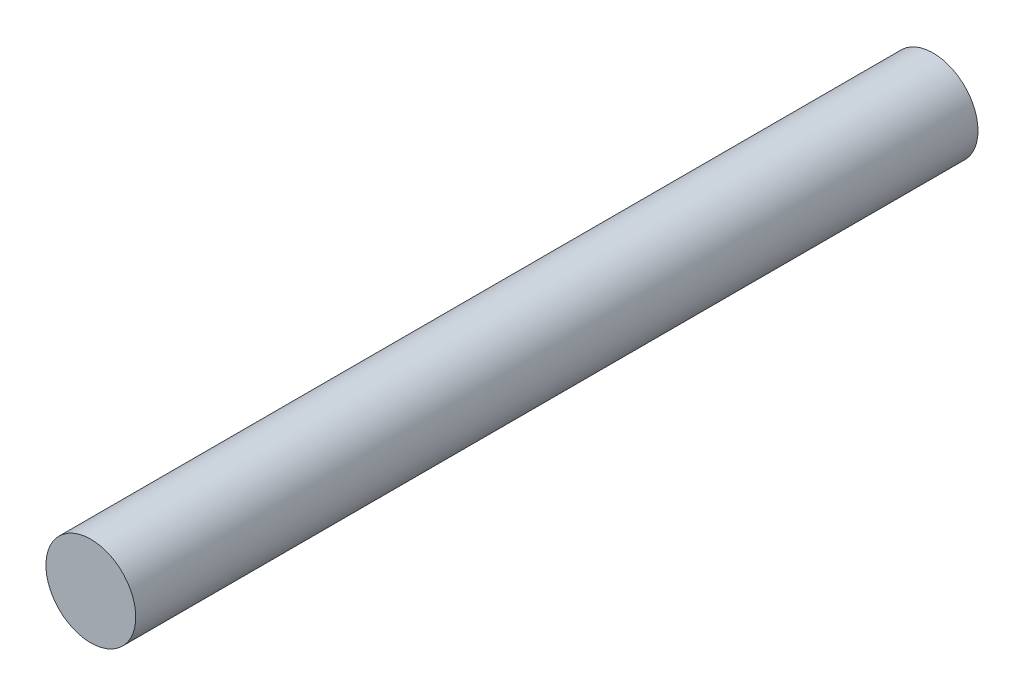
ISO-10303-21;
HEADER;
FILE_DESCRIPTION(('STEP AP214'),'2;1');
FILE_NAME('part.step','',(''),(''),'','','');
FILE_SCHEMA(('AUTOMOTIVE_DESIGN { 1 0 10303 214 1 1 1 1 }'));
ENDSEC;
DATA;
#1=APPLICATION_CONTEXT('core data for automotive mechanical design processes');
#2=APPLICATION_PROTOCOL_DEFINITION('international standard','automotive_design',2000,#1);
#3=PRODUCT_CONTEXT('',#1,'mechanical');
#4=PRODUCT('Part','Part','',(#3));
#5=PRODUCT_RELATED_PRODUCT_CATEGORY('part','',(#4));
#6=PRODUCT_DEFINITION_FORMATION('','',#4);
#7=PRODUCT_DEFINITION_CONTEXT('part definition',#1,'design');
#8=PRODUCT_DEFINITION('design','',#6,#7);
#9=PRODUCT_DEFINITION_SHAPE('','',#8);
#10=(LENGTH_UNIT() NAMED_UNIT(*) SI_UNIT(.MILLI.,.METRE.));
#11=(NAMED_UNIT(*) PLANE_ANGLE_UNIT() SI_UNIT($,.RADIAN.));
#12=(NAMED_UNIT(*) SI_UNIT($,.STERADIAN.) SOLID_ANGLE_UNIT());
#13=UNCERTAINTY_MEASURE_WITH_UNIT(LENGTH_MEASURE(1.E-05),#10,'distance_accuracy_value','');
#14=(GEOMETRIC_REPRESENTATION_CONTEXT(3) GLOBAL_UNCERTAINTY_ASSIGNED_CONTEXT((#13)) GLOBAL_UNIT_ASSIGNED_CONTEXT((#10,
#11,#12)) REPRESENTATION_CONTEXT('',''));
#15=CARTESIAN_POINT('',(0.,0.,0.));
#16=DIRECTION('',(0.,0.,1.));
#17=DIRECTION('',(1.,0.,0.));
#18=AXIS2_PLACEMENT_3D('',#15,#16,#17);
#19=CARTESIAN_POINT('',(0.,0.,7.5));
#20=DIRECTION('',(0.,0.,-1.));
#21=DIRECTION('',(-1.,0.,0.));
#22=AXIS2_PLACEMENT_3D('',#19,#20,#21);
#23=CYLINDRICAL_SURFACE('',#22,0.4);
#24=CARTESIAN_POINT('',(0.,0.,7.5));
#25=DIRECTION('',(0.,0.,1.));
#26=DIRECTION('',(1.,0.,0.));
#27=AXIS2_PLACEMENT_3D('',#24,#25,#26);
#28=CIRCLE('',#27,0.4);
#29=CARTESIAN_POINT('',(0.4,0.,7.5));
#30=VERTEX_POINT('',#29);
#31=EDGE_CURVE('E10',#30,#30,#28,.T.);
#32=ORIENTED_EDGE('',*,*,#31,.F.);
#33=EDGE_LOOP('',(#32));
#34=FACE_BOUND('',#33,.T.);
#35=CARTESIAN_POINT('',(0.,0.,0.));
#36=DIRECTION('',(0.,0.,1.));
#37=DIRECTION('',(1.,0.,0.));
#38=AXIS2_PLACEMENT_3D('',#35,#36,#37);
#39=CIRCLE('',#38,0.4);
#40=CARTESIAN_POINT('',(0.4,0.,0.));
#41=VERTEX_POINT('',#40);
#42=EDGE_CURVE('E40',#41,#41,#39,.T.);
#43=ORIENTED_EDGE('',*,*,#42,.T.);
#44=EDGE_LOOP('',(#43));
#45=FACE_BOUND('',#44,.T.);
#46=ADVANCED_FACE('F37',(#34,#45),#23,.T.);
#47=CARTESIAN_POINT('',(0.,0.,7.5));
#48=DIRECTION('',(0.,0.,1.));
#49=DIRECTION('',(1.,0.,0.));
#50=AXIS2_PLACEMENT_3D('',#47,#48,#49);
#51=PLANE('',#50);
#52=ORIENTED_EDGE('',*,*,#31,.T.);
#53=EDGE_LOOP('',(#52));
#54=FACE_BOUND('',#53,.T.);
#55=ADVANCED_FACE('F54',(#54),#51,.T.);
#56=CARTESIAN_POINT('',(0.,0.,0.));
#57=DIRECTION('',(0.,0.,1.));
#58=DIRECTION('',(1.,0.,0.));
#59=AXIS2_PLACEMENT_3D('',#56,#57,#58);
#60=PLANE('',#59);
#61=ORIENTED_EDGE('',*,*,#42,.F.);
#62=EDGE_LOOP('',(#61));
#63=FACE_BOUND('',#62,.T.);
#64=ADVANCED_FACE('F52',(#63),#60,.F.);
#65=CLOSED_SHELL('',(#46,#55,#64));
#66=MANIFOLD_SOLID_BREP('B2',#65);
#67=ADVANCED_BREP_SHAPE_REPRESENTATION('',(#18,#66),#14);
#68=SHAPE_DEFINITION_REPRESENTATION(#9,#67);
ENDSEC;
END-ISO-10303-21;
